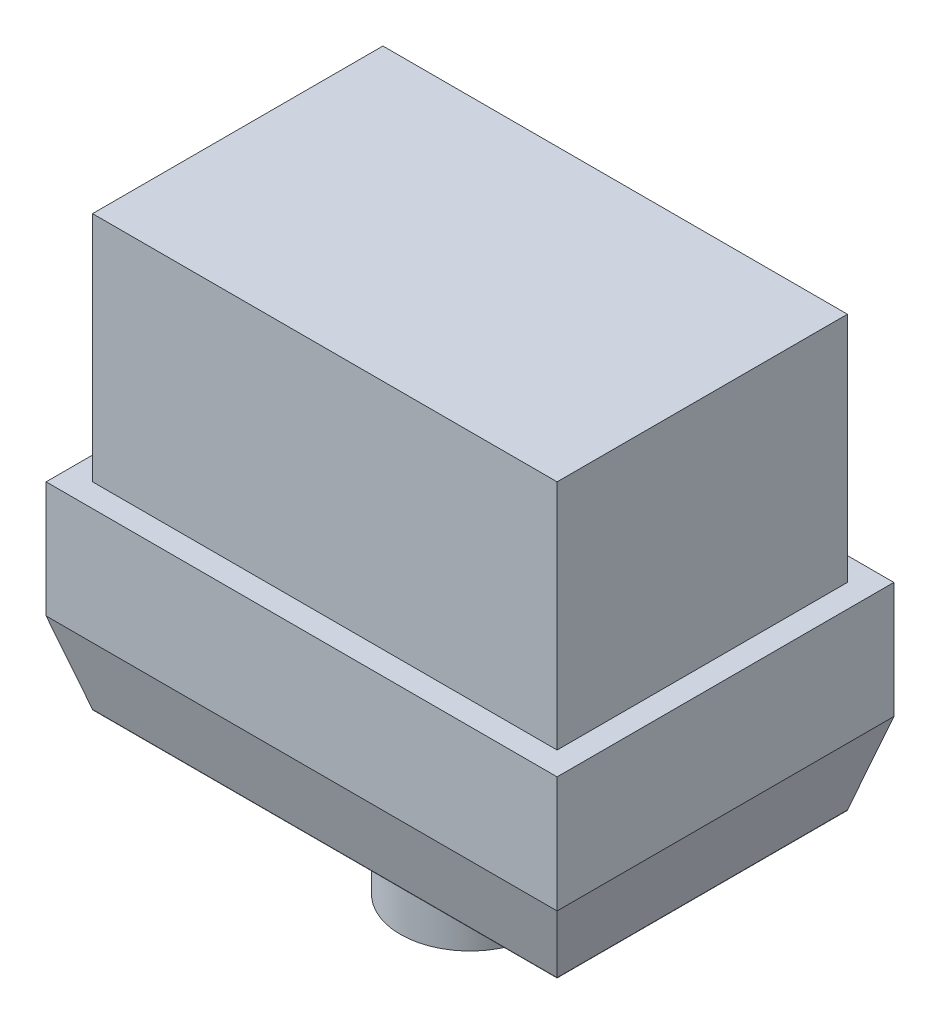
ISO-10303-21;
HEADER;
FILE_DESCRIPTION(('STEP AP214'),'2;1');
FILE_NAME('part.step','',(''),(''),'','','');
FILE_SCHEMA(('AUTOMOTIVE_DESIGN { 1 0 10303 214 1 1 1 1 }'));
ENDSEC;
DATA;
#1=APPLICATION_CONTEXT('core data for automotive mechanical design processes');
#2=APPLICATION_PROTOCOL_DEFINITION('international standard','automotive_design',2000,#1);
#3=PRODUCT_CONTEXT('',#1,'mechanical');
#4=PRODUCT('Part','Part','',(#3));
#5=PRODUCT_RELATED_PRODUCT_CATEGORY('part','',(#4));
#6=PRODUCT_DEFINITION_FORMATION('','',#4);
#7=PRODUCT_DEFINITION_CONTEXT('part definition',#1,'design');
#8=PRODUCT_DEFINITION('design','',#6,#7);
#9=PRODUCT_DEFINITION_SHAPE('','',#8);
#10=(LENGTH_UNIT() NAMED_UNIT(*) SI_UNIT(.MILLI.,.METRE.));
#11=(NAMED_UNIT(*) PLANE_ANGLE_UNIT() SI_UNIT($,.RADIAN.));
#12=(NAMED_UNIT(*) SI_UNIT($,.STERADIAN.) SOLID_ANGLE_UNIT());
#13=UNCERTAINTY_MEASURE_WITH_UNIT(LENGTH_MEASURE(1.E-05),#10,'distance_accuracy_value','');
#14=(GEOMETRIC_REPRESENTATION_CONTEXT(3) GLOBAL_UNCERTAINTY_ASSIGNED_CONTEXT((#13)) GLOBAL_UNIT_ASSIGNED_CONTEXT((#10,
#11,#12)) REPRESENTATION_CONTEXT('',''));
#15=CARTESIAN_POINT('',(0.,0.,0.));
#16=DIRECTION('',(0.,0.,1.));
#17=DIRECTION('',(1.,0.,0.));
#18=AXIS2_PLACEMENT_3D('',#15,#16,#17);
#19=CARTESIAN_POINT('',(0.,30.,0.));
#20=DIRECTION('',(1.,0.,0.));
#21=DIRECTION('',(0.,0.,-1.));
#22=AXIS2_PLACEMENT_3D('',#19,#20,#21);
#23=PLANE('',#22);
#24=DIRECTION('',(0.,0.,-1.));
#25=VECTOR('',#24,1.);
#26=CARTESIAN_POINT('',(0.,10.,0.));
#27=LINE('',#26,#25);
#28=CARTESIAN_POINT('',(0.,10.,0.));
#29=VERTEX_POINT('',#28);
#30=CARTESIAN_POINT('',(0.,10.,-25.));
#31=VERTEX_POINT('',#30);
#32=EDGE_CURVE('E190',#29,#31,#27,.T.);
#33=ORIENTED_EDGE('',*,*,#32,.F.);
#34=DIRECTION('',(0.,-1.,0.));
#35=VECTOR('',#34,1.);
#36=CARTESIAN_POINT('',(0.,30.,0.));
#37=LINE('',#36,#35);
#38=CARTESIAN_POINT('',(0.,30.,0.));
#39=VERTEX_POINT('',#38);
#40=EDGE_CURVE('E210',#39,#29,#37,.T.);
#41=ORIENTED_EDGE('',*,*,#40,.F.);
#42=DIRECTION('',(0.,0.,1.));
#43=VECTOR('',#42,1.);
#44=CARTESIAN_POINT('',(0.,30.,0.));
#45=LINE('',#44,#43);
#46=CARTESIAN_POINT('',(0.,30.,-25.));
#47=VERTEX_POINT('',#46);
#48=EDGE_CURVE('E193',#47,#39,#45,.T.);
#49=ORIENTED_EDGE('',*,*,#48,.F.);
#50=DIRECTION('',(0.,-1.,0.));
#51=VECTOR('',#50,1.);
#52=CARTESIAN_POINT('',(0.,30.,-25.));
#53=LINE('',#52,#51);
#54=EDGE_CURVE('E202',#47,#31,#53,.T.);
#55=ORIENTED_EDGE('',*,*,#54,.T.);
#56=EDGE_LOOP('',(#33,#41,#49,#55));
#57=FACE_BOUND('',#56,.T.);
#58=ADVANCED_FACE('F39',(#57),#23,.F.);
#59=CARTESIAN_POINT('',(0.,30.,0.));
#60=DIRECTION('',(0.,0.,-1.));
#61=DIRECTION('',(-1.,0.,0.));
#62=AXIS2_PLACEMENT_3D('',#59,#60,#61);
#63=PLANE('',#62);
#64=DIRECTION('',(-1.,0.,0.));
#65=VECTOR('',#64,1.);
#66=CARTESIAN_POINT('',(0.,10.,0.));
#67=LINE('',#66,#65);
#68=CARTESIAN_POINT('',(40.,10.,0.));
#69=VERTEX_POINT('',#68);
#70=EDGE_CURVE('E187',#69,#29,#67,.T.);
#71=ORIENTED_EDGE('',*,*,#70,.F.);
#72=DIRECTION('',(0.,-1.,0.));
#73=VECTOR('',#72,1.);
#74=CARTESIAN_POINT('',(40.,30.,0.));
#75=LINE('',#74,#73);
#76=CARTESIAN_POINT('',(40.,30.,0.));
#77=VERTEX_POINT('',#76);
#78=EDGE_CURVE('E207',#77,#69,#75,.T.);
#79=ORIENTED_EDGE('',*,*,#78,.F.);
#80=DIRECTION('',(1.,0.,0.));
#81=VECTOR('',#80,1.);
#82=CARTESIAN_POINT('',(0.,30.,0.));
#83=LINE('',#82,#81);
#84=EDGE_CURVE('E196',#39,#77,#83,.T.);
#85=ORIENTED_EDGE('',*,*,#84,.F.);
#86=ORIENTED_EDGE('',*,*,#40,.T.);
#87=EDGE_LOOP('',(#71,#79,#85,#86));
#88=FACE_BOUND('',#87,.T.);
#89=ADVANCED_FACE('F290',(#88),#63,.F.);
#90=CARTESIAN_POINT('',(40.,30.,0.));
#91=DIRECTION('',(-1.,0.,0.));
#92=DIRECTION('',(0.,0.,1.));
#93=AXIS2_PLACEMENT_3D('',#90,#91,#92);
#94=PLANE('',#93);
#95=DIRECTION('',(0.,0.,1.));
#96=VECTOR('',#95,1.);
#97=CARTESIAN_POINT('',(40.,10.,0.));
#98=LINE('',#97,#96);
#99=CARTESIAN_POINT('',(40.,10.,-25.));
#100=VERTEX_POINT('',#99);
#101=EDGE_CURVE('E184',#100,#69,#98,.T.);
#102=ORIENTED_EDGE('',*,*,#101,.F.);
#103=DIRECTION('',(0.,-1.,0.));
#104=VECTOR('',#103,1.);
#105=CARTESIAN_POINT('',(40.,30.,-25.));
#106=LINE('',#105,#104);
#107=CARTESIAN_POINT('',(40.,30.,-25.));
#108=VERTEX_POINT('',#107);
#109=EDGE_CURVE('E205',#108,#100,#106,.T.);
#110=ORIENTED_EDGE('',*,*,#109,.F.);
#111=DIRECTION('',(0.,0.,-1.));
#112=VECTOR('',#111,1.);
#113=CARTESIAN_POINT('',(40.,30.,0.));
#114=LINE('',#113,#112);
#115=EDGE_CURVE('E198',#77,#108,#114,.T.);
#116=ORIENTED_EDGE('',*,*,#115,.F.);
#117=ORIENTED_EDGE('',*,*,#78,.T.);
#118=EDGE_LOOP('',(#102,#110,#116,#117));
#119=FACE_BOUND('',#118,.T.);
#120=ADVANCED_FACE('F297',(#119),#94,.F.);
#121=CARTESIAN_POINT('',(0.,30.,-25.));
#122=DIRECTION('',(0.,0.,1.));
#123=DIRECTION('',(1.,0.,0.));
#124=AXIS2_PLACEMENT_3D('',#121,#122,#123);
#125=PLANE('',#124);
#126=DIRECTION('',(1.,0.,0.));
#127=VECTOR('',#126,1.);
#128=CARTESIAN_POINT('',(0.,10.,-25.));
#129=LINE('',#128,#127);
#130=EDGE_CURVE('E213',#31,#100,#129,.T.);
#131=ORIENTED_EDGE('',*,*,#130,.F.);
#132=ORIENTED_EDGE('',*,*,#54,.F.);
#133=DIRECTION('',(-1.,0.,0.));
#134=VECTOR('',#133,1.);
#135=CARTESIAN_POINT('',(0.,30.,-25.));
#136=LINE('',#135,#134);
#137=EDGE_CURVE('E200',#108,#47,#136,.T.);
#138=ORIENTED_EDGE('',*,*,#137,.F.);
#139=ORIENTED_EDGE('',*,*,#109,.T.);
#140=EDGE_LOOP('',(#131,#132,#138,#139));
#141=FACE_BOUND('',#140,.T.);
#142=ADVANCED_FACE('F313',(#141),#125,.F.);
#143=CARTESIAN_POINT('',(0.,30.,0.));
#144=DIRECTION('',(0.,-1.,0.));
#145=DIRECTION('',(0.,0.,-1.));
#146=AXIS2_PLACEMENT_3D('',#143,#144,#145);
#147=PLANE('',#146);
#148=ORIENTED_EDGE('',*,*,#48,.T.);
#149=ORIENTED_EDGE('',*,*,#84,.T.);
#150=ORIENTED_EDGE('',*,*,#115,.T.);
#151=ORIENTED_EDGE('',*,*,#137,.T.);
#152=EDGE_LOOP('',(#148,#149,#150,#151));
#153=FACE_BOUND('',#152,.T.);
#154=ADVANCED_FACE('F317',(#153),#147,.F.);
#155=CARTESIAN_POINT('',(0.,10.,0.));
#156=DIRECTION('',(0.,-1.,0.));
#157=DIRECTION('',(0.,0.,-1.));
#158=AXIS2_PLACEMENT_3D('',#155,#156,#157);
#159=PLANE('',#158);
#160=DIRECTION('',(0.,0.,1.));
#161=VECTOR('',#160,1.);
#162=CARTESIAN_POINT('',(-2.,10.,2.));
#163=LINE('',#162,#161);
#164=CARTESIAN_POINT('',(-2.,10.,-27.));
#165=VERTEX_POINT('',#164);
#166=CARTESIAN_POINT('',(-2.,10.,2.));
#167=VERTEX_POINT('',#166);
#168=EDGE_CURVE('E158',#165,#167,#163,.T.);
#169=ORIENTED_EDGE('',*,*,#168,.T.);
#170=DIRECTION('',(1.,0.,0.));
#171=VECTOR('',#170,1.);
#172=CARTESIAN_POINT('',(-2.,10.,2.));
#173=LINE('',#172,#171);
#174=CARTESIAN_POINT('',(42.,10.,2.));
#175=VERTEX_POINT('',#174);
#176=EDGE_CURVE('E161',#167,#175,#173,.T.);
#177=ORIENTED_EDGE('',*,*,#176,.T.);
#178=DIRECTION('',(0.,0.,-1.));
#179=VECTOR('',#178,1.);
#180=CARTESIAN_POINT('',(42.,10.,2.));
#181=LINE('',#180,#179);
#182=CARTESIAN_POINT('',(42.,10.,-27.));
#183=VERTEX_POINT('',#182);
#184=EDGE_CURVE('E164',#175,#183,#181,.T.);
#185=ORIENTED_EDGE('',*,*,#184,.T.);
#186=DIRECTION('',(-1.,0.,0.));
#187=VECTOR('',#186,1.);
#188=CARTESIAN_POINT('',(-2.,10.,-27.));
#189=LINE('',#188,#187);
#190=EDGE_CURVE('E166',#183,#165,#189,.T.);
#191=ORIENTED_EDGE('',*,*,#190,.T.);
#192=EDGE_LOOP('',(#169,#177,#185,#191));
#193=FACE_BOUND('',#192,.T.);
#194=ORIENTED_EDGE('',*,*,#70,.T.);
#195=ORIENTED_EDGE('',*,*,#32,.T.);
#196=ORIENTED_EDGE('',*,*,#130,.T.);
#197=ORIENTED_EDGE('',*,*,#101,.T.);
#198=EDGE_LOOP('',(#194,#195,#196,#197));
#199=FACE_BOUND('',#198,.T.);
#200=ADVANCED_FACE('F321',(#193,#199),#159,.F.);
#201=CARTESIAN_POINT('',(-2.,10.,2.));
#202=DIRECTION('',(1.,0.,0.));
#203=DIRECTION('',(0.,0.,-1.));
#204=AXIS2_PLACEMENT_3D('',#201,#202,#203);
#205=PLANE('',#204);
#206=DIRECTION('',(0.,0.,1.));
#207=VECTOR('',#206,1.);
#208=CARTESIAN_POINT('',(-2.,0.,2.));
#209=LINE('',#208,#207);
#210=CARTESIAN_POINT('',(-2.,0.,-27.));
#211=VERTEX_POINT('',#210);
#212=CARTESIAN_POINT('',(-2.,0.,2.));
#213=VERTEX_POINT('',#212);
#214=EDGE_CURVE('E149',#211,#213,#209,.T.);
#215=ORIENTED_EDGE('',*,*,#214,.T.);
#216=DIRECTION('',(0.,-1.,0.));
#217=VECTOR('',#216,1.);
#218=CARTESIAN_POINT('',(-2.,10.,2.));
#219=LINE('',#218,#217);
#220=EDGE_CURVE('E182',#167,#213,#219,.T.);
#221=ORIENTED_EDGE('',*,*,#220,.F.);
#222=ORIENTED_EDGE('',*,*,#168,.F.);
#223=DIRECTION('',(0.,-1.,0.));
#224=VECTOR('',#223,1.);
#225=CARTESIAN_POINT('',(-2.,10.,-27.));
#226=LINE('',#225,#224);
#227=EDGE_CURVE('E167',#165,#211,#226,.T.);
#228=ORIENTED_EDGE('',*,*,#227,.T.);
#229=EDGE_LOOP('',(#215,#221,#222,#228));
#230=FACE_BOUND('',#229,.T.);
#231=ADVANCED_FACE('F323',(#230),#205,.F.);
#232=CARTESIAN_POINT('',(-2.,10.,2.));
#233=DIRECTION('',(0.,0.,-1.));
#234=DIRECTION('',(-1.,0.,0.));
#235=AXIS2_PLACEMENT_3D('',#232,#233,#234);
#236=PLANE('',#235);
#237=DIRECTION('',(1.,0.,0.));
#238=VECTOR('',#237,1.);
#239=CARTESIAN_POINT('',(-2.,0.,2.));
#240=LINE('',#239,#238);
#241=CARTESIAN_POINT('',(42.,0.,2.));
#242=VERTEX_POINT('',#241);
#243=EDGE_CURVE('E152',#213,#242,#240,.T.);
#244=ORIENTED_EDGE('',*,*,#243,.T.);
#245=DIRECTION('',(0.,-1.,0.));
#246=VECTOR('',#245,1.);
#247=CARTESIAN_POINT('',(42.,10.,2.));
#248=LINE('',#247,#246);
#249=EDGE_CURVE('E179',#175,#242,#248,.T.);
#250=ORIENTED_EDGE('',*,*,#249,.F.);
#251=ORIENTED_EDGE('',*,*,#176,.F.);
#252=ORIENTED_EDGE('',*,*,#220,.T.);
#253=EDGE_LOOP('',(#244,#250,#251,#252));
#254=FACE_BOUND('',#253,.T.);
#255=ADVANCED_FACE('F326',(#254),#236,.F.);
#256=CARTESIAN_POINT('',(42.,10.,2.));
#257=DIRECTION('',(-1.,0.,0.));
#258=DIRECTION('',(0.,0.,1.));
#259=AXIS2_PLACEMENT_3D('',#256,#257,#258);
#260=PLANE('',#259);
#261=DIRECTION('',(0.,0.,-1.));
#262=VECTOR('',#261,1.);
#263=CARTESIAN_POINT('',(42.,0.,2.));
#264=LINE('',#263,#262);
#265=CARTESIAN_POINT('',(42.,0.,-27.));
#266=VERTEX_POINT('',#265);
#267=EDGE_CURVE('E170',#242,#266,#264,.T.);
#268=ORIENTED_EDGE('',*,*,#267,.T.);
#269=DIRECTION('',(0.,-1.,0.));
#270=VECTOR('',#269,1.);
#271=CARTESIAN_POINT('',(42.,10.,-27.));
#272=LINE('',#271,#270);
#273=EDGE_CURVE('E176',#183,#266,#272,.T.);
#274=ORIENTED_EDGE('',*,*,#273,.F.);
#275=ORIENTED_EDGE('',*,*,#184,.F.);
#276=ORIENTED_EDGE('',*,*,#249,.T.);
#277=EDGE_LOOP('',(#268,#274,#275,#276));
#278=FACE_BOUND('',#277,.T.);
#279=ADVANCED_FACE('F330',(#278),#260,.F.);
#280=CARTESIAN_POINT('',(-2.,10.,-27.));
#281=DIRECTION('',(0.,0.,1.));
#282=DIRECTION('',(1.,0.,0.));
#283=AXIS2_PLACEMENT_3D('',#280,#281,#282);
#284=PLANE('',#283);
#285=DIRECTION('',(-1.,0.,0.));
#286=VECTOR('',#285,1.);
#287=CARTESIAN_POINT('',(-2.,0.,-27.));
#288=LINE('',#287,#286);
#289=EDGE_CURVE('E162',#266,#211,#288,.T.);
#290=ORIENTED_EDGE('',*,*,#289,.T.);
#291=ORIENTED_EDGE('',*,*,#227,.F.);
#292=ORIENTED_EDGE('',*,*,#190,.F.);
#293=ORIENTED_EDGE('',*,*,#273,.T.);
#294=EDGE_LOOP('',(#290,#291,#292,#293));
#295=FACE_BOUND('',#294,.T.);
#296=ADVANCED_FACE('F334',(#295),#284,.F.);
#297=CARTESIAN_POINT('',(0.,-14.,-25.));
#298=DIRECTION('',(1.,0.,0.));
#299=DIRECTION('',(0.,0.,-1.));
#300=AXIS2_PLACEMENT_3D('',#297,#298,#299);
#301=PLANE('',#300);
#302=DIRECTION('',(0.,1.,0.));
#303=VECTOR('',#302,1.);
#304=CARTESIAN_POINT('',(0.,-14.,0.));
#305=LINE('',#304,#303);
#306=CARTESIAN_POINT('',(0.,-7.,0.));
#307=VERTEX_POINT('',#306);
#308=CARTESIAN_POINT('',(0.,-6.97482888768197,0.));
#309=VERTEX_POINT('',#308);
#310=EDGE_CURVE('E268',#307,#309,#305,.T.);
#311=ORIENTED_EDGE('',*,*,#310,.T.);
#312=DIRECTION('',(0.,0.,-1.));
#313=VECTOR('',#312,1.);
#314=CARTESIAN_POINT('',(0.,-6.97482888768197,-25.));
#315=LINE('',#314,#313);
#316=CARTESIAN_POINT('',(0.,-6.97482888768197,-25.));
#317=VERTEX_POINT('',#316);
#318=EDGE_CURVE('E49',#309,#317,#315,.T.);
#319=ORIENTED_EDGE('',*,*,#318,.T.);
#320=DIRECTION('',(0.,1.,0.));
#321=VECTOR('',#320,1.);
#322=CARTESIAN_POINT('',(0.,-14.,-25.));
#323=LINE('',#322,#321);
#324=CARTESIAN_POINT('',(0.,-7.,-25.));
#325=VERTEX_POINT('',#324);
#326=EDGE_CURVE('E142',#325,#317,#323,.T.);
#327=ORIENTED_EDGE('',*,*,#326,.F.);
#328=DIRECTION('',(0.,0.,-1.));
#329=VECTOR('',#328,1.);
#330=CARTESIAN_POINT('',(0.,-7.,-25.));
#331=LINE('',#330,#329);
#332=EDGE_CURVE('E130',#307,#325,#331,.T.);
#333=ORIENTED_EDGE('',*,*,#332,.F.);
#334=EDGE_LOOP('',(#311,#319,#327,#333));
#335=FACE_BOUND('',#334,.T.);
#336=ADVANCED_FACE('F148',(#335),#301,.F.);
#337=CARTESIAN_POINT('',(0.,-14.,-25.));
#338=DIRECTION('',(0.,0.,1.));
#339=DIRECTION('',(1.,0.,0.));
#340=AXIS2_PLACEMENT_3D('',#337,#338,#339);
#341=PLANE('',#340);
#342=ORIENTED_EDGE('',*,*,#326,.T.);
#343=DIRECTION('',(1.,0.,0.));
#344=VECTOR('',#343,1.);
#345=CARTESIAN_POINT('',(0.,-6.97482888768197,-25.));
#346=LINE('',#345,#344);
#347=CARTESIAN_POINT('',(40.,-6.97482888768197,-25.));
#348=VERTEX_POINT('',#347);
#349=EDGE_CURVE('E222',#317,#348,#346,.T.);
#350=ORIENTED_EDGE('',*,*,#349,.T.);
#351=DIRECTION('',(0.,1.,0.));
#352=VECTOR('',#351,1.);
#353=CARTESIAN_POINT('',(40.,-14.,-25.));
#354=LINE('',#353,#352);
#355=CARTESIAN_POINT('',(40.,-7.,-25.));
#356=VERTEX_POINT('',#355);
#357=EDGE_CURVE('E145',#356,#348,#354,.T.);
#358=ORIENTED_EDGE('',*,*,#357,.F.);
#359=DIRECTION('',(1.,0.,0.));
#360=VECTOR('',#359,1.);
#361=CARTESIAN_POINT('',(0.,-7.,-25.));
#362=LINE('',#361,#360);
#363=EDGE_CURVE('E133',#325,#356,#362,.T.);
#364=ORIENTED_EDGE('',*,*,#363,.F.);
#365=EDGE_LOOP('',(#342,#350,#358,#364));
#366=FACE_BOUND('',#365,.T.);
#367=ADVANCED_FACE('F141',(#366),#341,.F.);
#368=CARTESIAN_POINT('',(40.,-14.,-25.));
#369=DIRECTION('',(-1.,0.,0.));
#370=DIRECTION('',(0.,0.,1.));
#371=AXIS2_PLACEMENT_3D('',#368,#369,#370);
#372=PLANE('',#371);
#373=ORIENTED_EDGE('',*,*,#357,.T.);
#374=DIRECTION('',(0.,0.,1.));
#375=VECTOR('',#374,1.);
#376=CARTESIAN_POINT('',(40.,-6.97482888768197,-25.));
#377=LINE('',#376,#375);
#378=CARTESIAN_POINT('',(40.,-6.97482888768197,0.));
#379=VERTEX_POINT('',#378);
#380=EDGE_CURVE('E219',#348,#379,#377,.T.);
#381=ORIENTED_EDGE('',*,*,#380,.T.);
#382=DIRECTION('',(0.,1.,0.));
#383=VECTOR('',#382,1.);
#384=CARTESIAN_POINT('',(40.,-14.,0.));
#385=LINE('',#384,#383);
#386=CARTESIAN_POINT('',(40.,-7.,0.));
#387=VERTEX_POINT('',#386);
#388=EDGE_CURVE('E154',#387,#379,#385,.T.);
#389=ORIENTED_EDGE('',*,*,#388,.F.);
#390=DIRECTION('',(0.,0.,1.));
#391=VECTOR('',#390,1.);
#392=CARTESIAN_POINT('',(40.,-7.,-25.));
#393=LINE('',#392,#391);
#394=EDGE_CURVE('E146',#356,#387,#393,.T.);
#395=ORIENTED_EDGE('',*,*,#394,.F.);
#396=EDGE_LOOP('',(#373,#381,#389,#395));
#397=FACE_BOUND('',#396,.T.);
#398=ADVANCED_FACE('F272',(#397),#372,.F.);
#399=CARTESIAN_POINT('',(0.,-14.,0.));
#400=DIRECTION('',(0.,0.,-1.));
#401=DIRECTION('',(-1.,0.,0.));
#402=AXIS2_PLACEMENT_3D('',#399,#400,#401);
#403=PLANE('',#402);
#404=ORIENTED_EDGE('',*,*,#388,.T.);
#405=DIRECTION('',(-1.,0.,0.));
#406=VECTOR('',#405,1.);
#407=CARTESIAN_POINT('',(0.,-6.97482888768197,0.));
#408=LINE('',#407,#406);
#409=EDGE_CURVE('E11',#379,#309,#408,.T.);
#410=ORIENTED_EDGE('',*,*,#409,.T.);
#411=ORIENTED_EDGE('',*,*,#310,.F.);
#412=DIRECTION('',(-1.,0.,0.));
#413=VECTOR('',#412,1.);
#414=CARTESIAN_POINT('',(0.,-7.,0.));
#415=LINE('',#414,#413);
#416=EDGE_CURVE('E136',#387,#307,#415,.T.);
#417=ORIENTED_EDGE('',*,*,#416,.F.);
#418=EDGE_LOOP('',(#404,#410,#411,#417));
#419=FACE_BOUND('',#418,.T.);
#420=ADVANCED_FACE('F270',(#419),#403,.F.);
#421=CARTESIAN_POINT('',(0.,-7.,0.));
#422=DIRECTION('',(0.,1.,0.));
#423=DIRECTION('',(0.,0.,1.));
#424=AXIS2_PLACEMENT_3D('',#421,#422,#423);
#425=PLANE('',#424);
#426=CARTESIAN_POINT('',(20.,-7.,-12.5));
#427=DIRECTION('',(0.,1.,0.));
#428=DIRECTION('',(0.,0.,1.));
#429=AXIS2_PLACEMENT_3D('',#426,#427,#428);
#430=CIRCLE('',#429,6.);
#431=CARTESIAN_POINT('',(20.,-7.,-6.50000000000001));
#432=VERTEX_POINT('',#431);
#433=EDGE_CURVE('E216',#432,#432,#430,.F.);
#434=ORIENTED_EDGE('',*,*,#433,.F.);
#435=EDGE_LOOP('',(#434));
#436=FACE_BOUND('',#435,.T.);
#437=CARTESIAN_POINT('',(6.5,-7.,-12.5));
#438=DIRECTION('',(0.,-1.,0.));
#439=DIRECTION('',(0.,0.,-1.));
#440=AXIS2_PLACEMENT_3D('',#437,#438,#439);
#441=CIRCLE('',#440,4.);
#442=CARTESIAN_POINT('',(6.5,-7.,-16.5));
#443=VERTEX_POINT('',#442);
#444=EDGE_CURVE('E250',#443,#443,#441,.T.);
#445=ORIENTED_EDGE('',*,*,#444,.F.);
#446=EDGE_LOOP('',(#445));
#447=FACE_BOUND('',#446,.T.);
#448=CARTESIAN_POINT('',(33.5,-7.,-12.5));
#449=DIRECTION('',(0.,-1.,0.));
#450=DIRECTION('',(0.,0.,1.));
#451=AXIS2_PLACEMENT_3D('',#448,#449,#450);
#452=CIRCLE('',#451,4.);
#453=CARTESIAN_POINT('',(33.5,-7.,-8.5));
#454=VERTEX_POINT('',#453);
#455=EDGE_CURVE('E244',#454,#454,#452,.T.);
#456=ORIENTED_EDGE('',*,*,#455,.F.);
#457=EDGE_LOOP('',(#456));
#458=FACE_BOUND('',#457,.T.);
#459=ORIENTED_EDGE('',*,*,#332,.T.);
#460=ORIENTED_EDGE('',*,*,#363,.T.);
#461=ORIENTED_EDGE('',*,*,#394,.T.);
#462=ORIENTED_EDGE('',*,*,#416,.T.);
#463=EDGE_LOOP('',(#459,#460,#461,#462));
#464=FACE_BOUND('',#463,.T.);
#465=ADVANCED_FACE('F132',(#436,#447,#458,#464),#425,.F.);
#466=CARTESIAN_POINT('',(33.5,-4.,-12.5));
#467=DIRECTION('',(0.,-1.,0.));
#468=DIRECTION('',(0.,0.,-1.));
#469=AXIS2_PLACEMENT_3D('',#466,#467,#468);
#470=CYLINDRICAL_SURFACE('',#469,4.);
#471=CARTESIAN_POINT('',(33.5,-4.,-12.5));
#472=DIRECTION('',(0.,-1.,0.));
#473=DIRECTION('',(0.,0.,1.));
#474=AXIS2_PLACEMENT_3D('',#471,#472,#473);
#475=CIRCLE('',#474,4.);
#476=CARTESIAN_POINT('',(33.5,-4.,-8.5));
#477=VERTEX_POINT('',#476);
#478=EDGE_CURVE('E239',#477,#477,#475,.T.);
#479=ORIENTED_EDGE('',*,*,#478,.F.);
#480=EDGE_LOOP('',(#479));
#481=FACE_BOUND('',#480,.T.);
#482=ORIENTED_EDGE('',*,*,#455,.T.);
#483=EDGE_LOOP('',(#482));
#484=FACE_BOUND('',#483,.T.);
#485=ADVANCED_FACE('F352',(#481,#484),#470,.F.);
#486=CARTESIAN_POINT('',(33.5,-4.,-12.5));
#487=DIRECTION('',(0.,1.,0.));
#488=DIRECTION('',(0.,0.,1.));
#489=AXIS2_PLACEMENT_3D('',#486,#487,#488);
#490=PLANE('',#489);
#491=CARTESIAN_POINT('',(33.5,-4.,-12.5));
#492=DIRECTION('',(0.,-1.,0.));
#493=DIRECTION('',(0.,0.,1.));
#494=AXIS2_PLACEMENT_3D('',#491,#492,#493);
#495=CIRCLE('',#494,2.65);
#496=CARTESIAN_POINT('',(33.5,-4.,-9.85));
#497=VERTEX_POINT('',#496);
#498=EDGE_CURVE('E260',#497,#497,#495,.T.);
#499=ORIENTED_EDGE('',*,*,#498,.F.);
#500=EDGE_LOOP('',(#499));
#501=FACE_BOUND('',#500,.T.);
#502=ORIENTED_EDGE('',*,*,#478,.T.);
#503=EDGE_LOOP('',(#502));
#504=FACE_BOUND('',#503,.T.);
#505=ADVANCED_FACE('F360',(#501,#504),#490,.F.);
#506=CARTESIAN_POINT('',(33.5,-4.,-12.5));
#507=DIRECTION('',(0.,-1.,0.));
#508=DIRECTION('',(0.,0.,-1.));
#509=AXIS2_PLACEMENT_3D('',#506,#507,#508);
#510=CYLINDRICAL_SURFACE('',#509,2.65);
#511=ORIENTED_EDGE('',*,*,#498,.T.);
#512=EDGE_LOOP('',(#511));
#513=FACE_BOUND('',#512,.T.);
#514=CARTESIAN_POINT('',(33.5,-7.,-12.5));
#515=DIRECTION('',(0.,-1.,0.));
#516=DIRECTION('',(0.,0.,1.));
#517=AXIS2_PLACEMENT_3D('',#514,#515,#516);
#518=CIRCLE('',#517,2.65);
#519=CARTESIAN_POINT('',(33.5,-7.,-9.85));
#520=VERTEX_POINT('',#519);
#521=EDGE_CURVE('E254',#520,#520,#518,.T.);
#522=ORIENTED_EDGE('',*,*,#521,.F.);
#523=EDGE_LOOP('',(#522));
#524=FACE_BOUND('',#523,.T.);
#525=ADVANCED_FACE('F356',(#513,#524),#510,.T.);
#526=CARTESIAN_POINT('',(6.5,-4.,-12.5));
#527=DIRECTION('',(0.,-1.,0.));
#528=DIRECTION('',(0.,0.,-1.));
#529=AXIS2_PLACEMENT_3D('',#526,#527,#528);
#530=CYLINDRICAL_SURFACE('',#529,4.);
#531=CARTESIAN_POINT('',(6.5,-4.,-12.5));
#532=DIRECTION('',(0.,-1.,0.));
#533=DIRECTION('',(0.,0.,-1.));
#534=AXIS2_PLACEMENT_3D('',#531,#532,#533);
#535=CIRCLE('',#534,4.);
#536=CARTESIAN_POINT('',(6.5,-4.,-16.5));
#537=VERTEX_POINT('',#536);
#538=EDGE_CURVE('E137',#537,#537,#535,.T.);
#539=ORIENTED_EDGE('',*,*,#538,.F.);
#540=EDGE_LOOP('',(#539));
#541=FACE_BOUND('',#540,.T.);
#542=ORIENTED_EDGE('',*,*,#444,.T.);
#543=EDGE_LOOP('',(#542));
#544=FACE_BOUND('',#543,.T.);
#545=ADVANCED_FACE('F359',(#541,#544),#530,.F.);
#546=CARTESIAN_POINT('',(6.5,-4.,-12.5));
#547=DIRECTION('',(0.,-1.,0.));
#548=DIRECTION('',(0.,0.,-1.));
#549=AXIS2_PLACEMENT_3D('',#546,#547,#548);
#550=PLANE('',#549);
#551=CARTESIAN_POINT('',(6.5,-4.,-12.5));
#552=DIRECTION('',(0.,-1.,0.));
#553=DIRECTION('',(0.,0.,-1.));
#554=AXIS2_PLACEMENT_3D('',#551,#552,#553);
#555=CIRCLE('',#554,2.65);
#556=CARTESIAN_POINT('',(6.5,-4.,-15.15));
#557=VERTEX_POINT('',#556);
#558=EDGE_CURVE('E247',#557,#557,#555,.T.);
#559=ORIENTED_EDGE('',*,*,#558,.F.);
#560=EDGE_LOOP('',(#559));
#561=FACE_BOUND('',#560,.T.);
#562=ORIENTED_EDGE('',*,*,#538,.T.);
#563=EDGE_LOOP('',(#562));
#564=FACE_BOUND('',#563,.T.);
#565=ADVANCED_FACE('F370',(#561,#564),#550,.T.);
#566=CARTESIAN_POINT('',(6.5,-4.,-12.5));
#567=DIRECTION('',(0.,-1.,0.));
#568=DIRECTION('',(0.,0.,-1.));
#569=AXIS2_PLACEMENT_3D('',#566,#567,#568);
#570=CYLINDRICAL_SURFACE('',#569,2.65);
#571=ORIENTED_EDGE('',*,*,#558,.T.);
#572=EDGE_LOOP('',(#571));
#573=FACE_BOUND('',#572,.T.);
#574=CARTESIAN_POINT('',(6.5,-7.,-12.5));
#575=DIRECTION('',(0.,-1.,0.));
#576=DIRECTION('',(0.,0.,-1.));
#577=AXIS2_PLACEMENT_3D('',#574,#575,#576);
#578=CIRCLE('',#577,2.65);
#579=CARTESIAN_POINT('',(6.5,-7.,-15.15));
#580=VERTEX_POINT('',#579);
#581=EDGE_CURVE('E251',#580,#580,#578,.T.);
#582=ORIENTED_EDGE('',*,*,#581,.F.);
#583=EDGE_LOOP('',(#582));
#584=FACE_BOUND('',#583,.T.);
#585=ADVANCED_FACE('F374',(#573,#584),#570,.T.);
#586=ORIENTED_EDGE('',*,*,#521,.T.);
#587=EDGE_LOOP('',(#586));
#588=FACE_BOUND('',#587,.T.);
#589=ADVANCED_FACE('F355',(#588),#425,.F.);
#590=ORIENTED_EDGE('',*,*,#581,.T.);
#591=EDGE_LOOP('',(#590));
#592=FACE_BOUND('',#591,.T.);
#593=ADVANCED_FACE('F354',(#592),#425,.F.);
#594=CARTESIAN_POINT('',(20.,-17.,-12.5));
#595=DIRECTION('',(0.,1.,0.));
#596=DIRECTION('',(0.,0.,1.));
#597=AXIS2_PLACEMENT_3D('',#594,#595,#596);
#598=CYLINDRICAL_SURFACE('',#597,6.);
#599=CARTESIAN_POINT('',(20.,-17.,-12.5));
#600=DIRECTION('',(0.,-1.,0.));
#601=DIRECTION('',(0.,0.,-1.));
#602=AXIS2_PLACEMENT_3D('',#599,#600,#601);
#603=CIRCLE('',#602,6.);
#604=CARTESIAN_POINT('',(20.,-17.,-18.5));
#605=VERTEX_POINT('',#604);
#606=EDGE_CURVE('E234',#605,#605,#603,.T.);
#607=ORIENTED_EDGE('',*,*,#606,.F.);
#608=EDGE_LOOP('',(#607));
#609=FACE_BOUND('',#608,.T.);
#610=ORIENTED_EDGE('',*,*,#433,.T.);
#611=EDGE_LOOP('',(#610));
#612=FACE_BOUND('',#611,.T.);
#613=ADVANCED_FACE('F379',(#609,#612),#598,.T.);
#614=CARTESIAN_POINT('',(20.,-17.,-12.5));
#615=DIRECTION('',(0.,-1.,0.));
#616=DIRECTION('',(0.,0.,-1.));
#617=AXIS2_PLACEMENT_3D('',#614,#615,#616);
#618=PLANE('',#617);
#619=ORIENTED_EDGE('',*,*,#606,.T.);
#620=EDGE_LOOP('',(#619));
#621=FACE_BOUND('',#620,.T.);
#622=ADVANCED_FACE('F382',(#621),#618,.T.);
#623=CARTESIAN_POINT('',(0.,-6.97482888768197,-25.));
#624=DIRECTION('',(0.961261695938321,0.275637355816993,0.));
#625=DIRECTION('',(0.,0.,-1.));
#626=AXIS2_PLACEMENT_3D('',#623,#624,#625);
#627=PLANE('',#626);
#628=DIRECTION('',(0.265727678029982,-0.926702542490086,-0.265727678029982));
#629=VECTOR('',#628,1.);
#630=CARTESIAN_POINT('',(0.,-6.97482888768197,0.));
#631=LINE('',#630,#629);
#632=EDGE_CURVE('E228',#213,#309,#631,.T.);
#633=ORIENTED_EDGE('',*,*,#632,.F.);
#634=ORIENTED_EDGE('',*,*,#214,.F.);
#635=DIRECTION('',(0.265727678029982,-0.926702542490086,0.265727678029982));
#636=VECTOR('',#635,1.);
#637=CARTESIAN_POINT('',(0.,-6.97482888768197,-25.));
#638=LINE('',#637,#636);
#639=EDGE_CURVE('E44',#317,#211,#638,.F.);
#640=ORIENTED_EDGE('',*,*,#639,.F.);
#641=ORIENTED_EDGE('',*,*,#318,.F.);
#642=EDGE_LOOP('',(#633,#634,#640,#641));
#643=FACE_BOUND('',#642,.T.);
#644=ADVANCED_FACE('F42',(#643),#627,.F.);
#645=CARTESIAN_POINT('',(0.,-6.97482888768197,-25.));
#646=DIRECTION('',(0.,0.275637355816993,0.961261695938321));
#647=DIRECTION('',(1.,0.,0.));
#648=AXIS2_PLACEMENT_3D('',#645,#646,#647);
#649=PLANE('',#648);
#650=ORIENTED_EDGE('',*,*,#639,.T.);
#651=ORIENTED_EDGE('',*,*,#289,.F.);
#652=DIRECTION('',(-0.265727678029981,-0.926702542490086,0.265727678029982));
#653=VECTOR('',#652,1.);
#654=CARTESIAN_POINT('',(37.1755520451518,-16.8248494812968,-22.1755520451518));
#655=LINE('',#654,#653);
#656=EDGE_CURVE('E227',#348,#266,#655,.F.);
#657=ORIENTED_EDGE('',*,*,#656,.F.);
#658=ORIENTED_EDGE('',*,*,#349,.F.);
#659=EDGE_LOOP('',(#650,#651,#657,#658));
#660=FACE_BOUND('',#659,.T.);
#661=ADVANCED_FACE('F281',(#660),#649,.F.);
#662=CARTESIAN_POINT('',(0.,-6.97482888768197,0.));
#663=DIRECTION('',(0.,0.275637355816993,-0.961261695938321));
#664=DIRECTION('',(-1.,0.,0.));
#665=AXIS2_PLACEMENT_3D('',#662,#663,#664);
#666=PLANE('',#665);
#667=ORIENTED_EDGE('',*,*,#632,.T.);
#668=ORIENTED_EDGE('',*,*,#409,.F.);
#669=DIRECTION('',(0.265727678029981,0.926702542490086,0.265727678029982));
#670=VECTOR('',#669,1.);
#671=CARTESIAN_POINT('',(37.1755520451518,-16.8248494812968,-2.82444795484822));
#672=LINE('',#671,#670);
#673=EDGE_CURVE('E225',#242,#379,#672,.F.);
#674=ORIENTED_EDGE('',*,*,#673,.F.);
#675=ORIENTED_EDGE('',*,*,#243,.F.);
#676=EDGE_LOOP('',(#667,#668,#674,#675));
#677=FACE_BOUND('',#676,.T.);
#678=ADVANCED_FACE('F279',(#677),#666,.F.);
#679=CARTESIAN_POINT('',(40.,-6.97482888768197,-25.));
#680=DIRECTION('',(-0.961261695938321,0.275637355816993,0.));
#681=DIRECTION('',(0.,0.,1.));
#682=AXIS2_PLACEMENT_3D('',#679,#680,#681);
#683=PLANE('',#682);
#684=ORIENTED_EDGE('',*,*,#656,.T.);
#685=ORIENTED_EDGE('',*,*,#267,.F.);
#686=ORIENTED_EDGE('',*,*,#673,.T.);
#687=ORIENTED_EDGE('',*,*,#380,.F.);
#688=EDGE_LOOP('',(#684,#685,#686,#687));
#689=FACE_BOUND('',#688,.T.);
#690=ADVANCED_FACE('F276',(#689),#683,.F.);
#691=CLOSED_SHELL('',(#58,#89,#120,#142,#154,#200,#231,#255,#279,#296,#336,#367,#398,#420,#465,
#485,#505,#525,#545,#565,#585,#589,#593,#613,#622,#644,#661,#678,#690));
#692=MANIFOLD_SOLID_BREP('B2',#691);
#693=ADVANCED_BREP_SHAPE_REPRESENTATION('',(#18,#692),#14);
#694=SHAPE_DEFINITION_REPRESENTATION(#9,#693);
ENDSEC;
END-ISO-10303-21;
